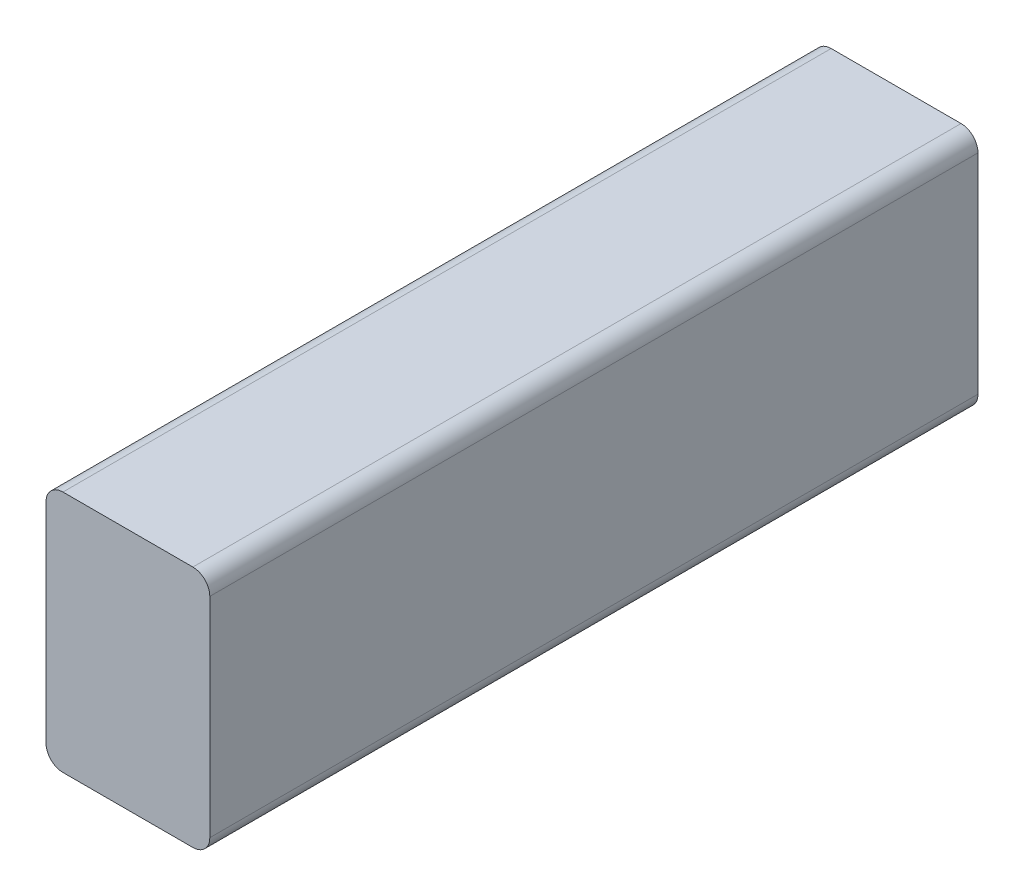
ISO-10303-21;
HEADER;
FILE_DESCRIPTION(('STEP AP214'),'2;1');
FILE_NAME('part.step','',(''),(''),'','','');
FILE_SCHEMA(('AUTOMOTIVE_DESIGN { 1 0 10303 214 1 1 1 1 }'));
ENDSEC;
DATA;
#1=APPLICATION_CONTEXT('core data for automotive mechanical design processes');
#2=APPLICATION_PROTOCOL_DEFINITION('international standard','automotive_design',2000,#1);
#3=PRODUCT_CONTEXT('',#1,'mechanical');
#4=PRODUCT('Part','Part','',(#3));
#5=PRODUCT_RELATED_PRODUCT_CATEGORY('part','',(#4));
#6=PRODUCT_DEFINITION_FORMATION('','',#4);
#7=PRODUCT_DEFINITION_CONTEXT('part definition',#1,'design');
#8=PRODUCT_DEFINITION('design','',#6,#7);
#9=PRODUCT_DEFINITION_SHAPE('','',#8);
#10=(LENGTH_UNIT() NAMED_UNIT(*) SI_UNIT(.MILLI.,.METRE.));
#11=(NAMED_UNIT(*) PLANE_ANGLE_UNIT() SI_UNIT($,.RADIAN.));
#12=(NAMED_UNIT(*) SI_UNIT($,.STERADIAN.) SOLID_ANGLE_UNIT());
#13=UNCERTAINTY_MEASURE_WITH_UNIT(LENGTH_MEASURE(1.E-05),#10,'distance_accuracy_value','');
#14=(GEOMETRIC_REPRESENTATION_CONTEXT(3) GLOBAL_UNCERTAINTY_ASSIGNED_CONTEXT((#13)) GLOBAL_UNIT_ASSIGNED_CONTEXT((#10,
#11,#12)) REPRESENTATION_CONTEXT('',''));
#15=CARTESIAN_POINT('',(0.,0.,0.));
#16=DIRECTION('',(0.,0.,1.));
#17=DIRECTION('',(1.,0.,0.));
#18=AXIS2_PLACEMENT_3D('',#15,#16,#17);
#19=CARTESIAN_POINT('',(14.5,21.5,136.));
#20=DIRECTION('',(-1.,0.,0.));
#21=DIRECTION('',(0.,-1.,0.));
#22=AXIS2_PLACEMENT_3D('',#19,#20,#21);
#23=PLANE('',#22);
#24=DIRECTION('',(0.,1.,0.));
#25=VECTOR('',#24,1.);
#26=CARTESIAN_POINT('',(14.5,21.5,136.));
#27=LINE('',#26,#25);
#28=CARTESIAN_POINT('',(14.5,-18.5,136.));
#29=VERTEX_POINT('',#28);
#30=CARTESIAN_POINT('',(14.5,18.5,136.));
#31=VERTEX_POINT('',#30);
#32=EDGE_CURVE('E130',#29,#31,#27,.T.);
#33=ORIENTED_EDGE('',*,*,#32,.F.);
#34=DIRECTION('',(0.,0.,-1.));
#35=VECTOR('',#34,1.);
#36=CARTESIAN_POINT('',(14.5,-18.5,136.));
#37=LINE('',#36,#35);
#38=CARTESIAN_POINT('',(14.5,-18.5,0.));
#39=VERTEX_POINT('',#38);
#40=EDGE_CURVE('E114',#29,#39,#37,.T.);
#41=ORIENTED_EDGE('',*,*,#40,.T.);
#42=DIRECTION('',(0.,1.,0.));
#43=VECTOR('',#42,1.);
#44=CARTESIAN_POINT('',(14.5,21.5,0.));
#45=LINE('',#44,#43);
#46=CARTESIAN_POINT('',(14.5,18.5,0.));
#47=VERTEX_POINT('',#46);
#48=EDGE_CURVE('E127',#39,#47,#45,.T.);
#49=ORIENTED_EDGE('',*,*,#48,.T.);
#50=DIRECTION('',(0.,0.,-1.));
#51=VECTOR('',#50,1.);
#52=CARTESIAN_POINT('',(14.5,18.5,136.));
#53=LINE('',#52,#51);
#54=EDGE_CURVE('E133',#47,#31,#53,.F.);
#55=ORIENTED_EDGE('',*,*,#54,.T.);
#56=EDGE_LOOP('',(#33,#41,#49,#55));
#57=FACE_BOUND('',#56,.T.);
#58=ADVANCED_FACE('F43',(#57),#23,.F.);
#59=CARTESIAN_POINT('',(-14.5,21.5,136.));
#60=DIRECTION('',(0.,-1.,0.));
#61=DIRECTION('',(0.,0.,-1.));
#62=AXIS2_PLACEMENT_3D('',#59,#60,#61);
#63=PLANE('',#62);
#64=DIRECTION('',(-1.,0.,0.));
#65=VECTOR('',#64,1.);
#66=CARTESIAN_POINT('',(-14.5,21.5,0.));
#67=LINE('',#66,#65);
#68=CARTESIAN_POINT('',(11.5,21.5,0.));
#69=VERTEX_POINT('',#68);
#70=CARTESIAN_POINT('',(-11.5,21.5,0.));
#71=VERTEX_POINT('',#70);
#72=EDGE_CURVE('E138',#69,#71,#67,.T.);
#73=ORIENTED_EDGE('',*,*,#72,.T.);
#74=DIRECTION('',(0.,0.,-1.));
#75=VECTOR('',#74,1.);
#76=CARTESIAN_POINT('',(-11.5,21.5,136.));
#77=LINE('',#76,#75);
#78=CARTESIAN_POINT('',(-11.5,21.5,136.));
#79=VERTEX_POINT('',#78);
#80=EDGE_CURVE('E11',#71,#79,#77,.F.);
#81=ORIENTED_EDGE('',*,*,#80,.T.);
#82=DIRECTION('',(-1.,0.,0.));
#83=VECTOR('',#82,1.);
#84=CARTESIAN_POINT('',(-14.5,21.5,136.));
#85=LINE('',#84,#83);
#86=CARTESIAN_POINT('',(11.5,21.5,136.));
#87=VERTEX_POINT('',#86);
#88=EDGE_CURVE('E190',#87,#79,#85,.T.);
#89=ORIENTED_EDGE('',*,*,#88,.F.);
#90=DIRECTION('',(0.,0.,-1.));
#91=VECTOR('',#90,1.);
#92=CARTESIAN_POINT('',(11.5,21.5,136.));
#93=LINE('',#92,#91);
#94=EDGE_CURVE('E52',#87,#69,#93,.T.);
#95=ORIENTED_EDGE('',*,*,#94,.T.);
#96=EDGE_LOOP('',(#73,#81,#89,#95));
#97=FACE_BOUND('',#96,.T.);
#98=ADVANCED_FACE('F188',(#97),#63,.F.);
#99=CARTESIAN_POINT('',(-14.5,21.5,136.));
#100=DIRECTION('',(1.,0.,0.));
#101=DIRECTION('',(0.,1.,0.));
#102=AXIS2_PLACEMENT_3D('',#99,#100,#101);
#103=PLANE('',#102);
#104=DIRECTION('',(0.,-1.,0.));
#105=VECTOR('',#104,1.);
#106=CARTESIAN_POINT('',(-14.5,21.5,0.));
#107=LINE('',#106,#105);
#108=CARTESIAN_POINT('',(-14.5,18.5,0.));
#109=VERTEX_POINT('',#108);
#110=CARTESIAN_POINT('',(-14.5,-18.5,0.));
#111=VERTEX_POINT('',#110);
#112=EDGE_CURVE('E142',#109,#111,#107,.T.);
#113=ORIENTED_EDGE('',*,*,#112,.T.);
#114=DIRECTION('',(0.,0.,-1.));
#115=VECTOR('',#114,1.);
#116=CARTESIAN_POINT('',(-14.5,-18.5,136.));
#117=LINE('',#116,#115);
#118=CARTESIAN_POINT('',(-14.5,-18.5,136.));
#119=VERTEX_POINT('',#118);
#120=EDGE_CURVE('E59',#111,#119,#117,.F.);
#121=ORIENTED_EDGE('',*,*,#120,.T.);
#122=DIRECTION('',(0.,-1.,0.));
#123=VECTOR('',#122,1.);
#124=CARTESIAN_POINT('',(-14.5,21.5,136.));
#125=LINE('',#124,#123);
#126=CARTESIAN_POINT('',(-14.5,18.5,136.));
#127=VERTEX_POINT('',#126);
#128=EDGE_CURVE('E198',#127,#119,#125,.T.);
#129=ORIENTED_EDGE('',*,*,#128,.F.);
#130=DIRECTION('',(0.,0.,-1.));
#131=VECTOR('',#130,1.);
#132=CARTESIAN_POINT('',(-14.5,18.5,136.));
#133=LINE('',#132,#131);
#134=EDGE_CURVE('E178',#127,#109,#133,.T.);
#135=ORIENTED_EDGE('',*,*,#134,.T.);
#136=EDGE_LOOP('',(#113,#121,#129,#135));
#137=FACE_BOUND('',#136,.T.);
#138=ADVANCED_FACE('F197',(#137),#103,.F.);
#139=CARTESIAN_POINT('',(-14.5,-21.5,136.));
#140=DIRECTION('',(0.,1.,0.));
#141=DIRECTION('',(0.,0.,1.));
#142=AXIS2_PLACEMENT_3D('',#139,#140,#141);
#143=PLANE('',#142);
#144=DIRECTION('',(1.,0.,0.));
#145=VECTOR('',#144,1.);
#146=CARTESIAN_POINT('',(-14.5,-21.5,0.));
#147=LINE('',#146,#145);
#148=CARTESIAN_POINT('',(-11.5,-21.5,0.));
#149=VERTEX_POINT('',#148);
#150=CARTESIAN_POINT('',(11.5,-21.5,0.));
#151=VERTEX_POINT('',#150);
#152=EDGE_CURVE('E150',#149,#151,#147,.T.);
#153=ORIENTED_EDGE('',*,*,#152,.T.);
#154=DIRECTION('',(0.,0.,-1.));
#155=VECTOR('',#154,1.);
#156=CARTESIAN_POINT('',(11.5,-21.5,136.));
#157=LINE('',#156,#155);
#158=CARTESIAN_POINT('',(11.5,-21.5,136.));
#159=VERTEX_POINT('',#158);
#160=EDGE_CURVE('E115',#151,#159,#157,.F.);
#161=ORIENTED_EDGE('',*,*,#160,.T.);
#162=DIRECTION('',(1.,0.,0.));
#163=VECTOR('',#162,1.);
#164=CARTESIAN_POINT('',(-14.5,-21.5,136.));
#165=LINE('',#164,#163);
#166=CARTESIAN_POINT('',(-11.5,-21.5,136.));
#167=VERTEX_POINT('',#166);
#168=EDGE_CURVE('E145',#167,#159,#165,.T.);
#169=ORIENTED_EDGE('',*,*,#168,.F.);
#170=DIRECTION('',(0.,0.,-1.));
#171=VECTOR('',#170,1.);
#172=CARTESIAN_POINT('',(-11.5,-21.5,136.));
#173=LINE('',#172,#171);
#174=EDGE_CURVE('E121',#167,#149,#173,.T.);
#175=ORIENTED_EDGE('',*,*,#174,.T.);
#176=EDGE_LOOP('',(#153,#161,#169,#175));
#177=FACE_BOUND('',#176,.T.);
#178=ADVANCED_FACE('F230',(#177),#143,.F.);
#179=CARTESIAN_POINT('',(0.,0.,136.));
#180=DIRECTION('',(0.,0.,1.));
#181=DIRECTION('',(1.,0.,0.));
#182=AXIS2_PLACEMENT_3D('',#179,#180,#181);
#183=PLANE('',#182);
#184=ORIENTED_EDGE('',*,*,#168,.T.);
#185=CARTESIAN_POINT('',(11.5,-18.5,136.));
#186=DIRECTION('',(0.,0.,1.));
#187=DIRECTION('',(1.,0.,0.));
#188=AXIS2_PLACEMENT_3D('',#185,#186,#187);
#189=CIRCLE('',#188,3.);
#190=EDGE_CURVE('E175',#159,#29,#189,.T.);
#191=ORIENTED_EDGE('',*,*,#190,.T.);
#192=ORIENTED_EDGE('',*,*,#32,.T.);
#193=CARTESIAN_POINT('',(11.5,18.5,136.));
#194=DIRECTION('',(0.,0.,1.));
#195=DIRECTION('',(1.,0.,0.));
#196=AXIS2_PLACEMENT_3D('',#193,#194,#195);
#197=CIRCLE('',#196,3.);
#198=EDGE_CURVE('E167',#31,#87,#197,.T.);
#199=ORIENTED_EDGE('',*,*,#198,.T.);
#200=ORIENTED_EDGE('',*,*,#88,.T.);
#201=CARTESIAN_POINT('',(-11.5,18.5,136.));
#202=DIRECTION('',(0.,0.,1.));
#203=DIRECTION('',(1.,0.,0.));
#204=AXIS2_PLACEMENT_3D('',#201,#202,#203);
#205=CIRCLE('',#204,3.);
#206=EDGE_CURVE('E66',#79,#127,#205,.T.);
#207=ORIENTED_EDGE('',*,*,#206,.T.);
#208=ORIENTED_EDGE('',*,*,#128,.T.);
#209=CARTESIAN_POINT('',(-11.5,-18.5,136.));
#210=DIRECTION('',(0.,0.,1.));
#211=DIRECTION('',(1.,0.,0.));
#212=AXIS2_PLACEMENT_3D('',#209,#210,#211);
#213=CIRCLE('',#212,3.);
#214=EDGE_CURVE('E172',#119,#167,#213,.T.);
#215=ORIENTED_EDGE('',*,*,#214,.T.);
#216=EDGE_LOOP('',(#184,#191,#192,#199,#200,#207,#208,#215));
#217=FACE_BOUND('',#216,.T.);
#218=ADVANCED_FACE('F207',(#217),#183,.T.);
#219=CARTESIAN_POINT('',(0.,0.,0.));
#220=DIRECTION('',(0.,0.,1.));
#221=DIRECTION('',(1.,0.,0.));
#222=AXIS2_PLACEMENT_3D('',#219,#220,#221);
#223=PLANE('',#222);
#224=ORIENTED_EDGE('',*,*,#48,.F.);
#225=CARTESIAN_POINT('',(11.5,-18.5,0.));
#226=DIRECTION('',(0.,0.,1.));
#227=DIRECTION('',(1.,0.,0.));
#228=AXIS2_PLACEMENT_3D('',#225,#226,#227);
#229=CIRCLE('',#228,3.);
#230=EDGE_CURVE('E110',#39,#151,#229,.F.);
#231=ORIENTED_EDGE('',*,*,#230,.T.);
#232=ORIENTED_EDGE('',*,*,#152,.F.);
#233=CARTESIAN_POINT('',(-11.5,-18.5,0.));
#234=DIRECTION('',(0.,0.,1.));
#235=DIRECTION('',(1.,0.,0.));
#236=AXIS2_PLACEMENT_3D('',#233,#234,#235);
#237=CIRCLE('',#236,3.);
#238=EDGE_CURVE('E122',#149,#111,#237,.F.);
#239=ORIENTED_EDGE('',*,*,#238,.T.);
#240=ORIENTED_EDGE('',*,*,#112,.F.);
#241=CARTESIAN_POINT('',(-11.5,18.5,0.));
#242=DIRECTION('',(0.,0.,1.));
#243=DIRECTION('',(1.,0.,0.));
#244=AXIS2_PLACEMENT_3D('',#241,#242,#243);
#245=CIRCLE('',#244,3.);
#246=EDGE_CURVE('E157',#109,#71,#245,.F.);
#247=ORIENTED_EDGE('',*,*,#246,.T.);
#248=ORIENTED_EDGE('',*,*,#72,.F.);
#249=CARTESIAN_POINT('',(11.5,18.5,0.));
#250=DIRECTION('',(0.,0.,1.));
#251=DIRECTION('',(1.,0.,0.));
#252=AXIS2_PLACEMENT_3D('',#249,#250,#251);
#253=CIRCLE('',#252,3.);
#254=EDGE_CURVE('E132',#69,#47,#253,.F.);
#255=ORIENTED_EDGE('',*,*,#254,.T.);
#256=EDGE_LOOP('',(#224,#231,#232,#239,#240,#247,#248,#255));
#257=FACE_BOUND('',#256,.T.);
#258=ADVANCED_FACE('F135',(#257),#223,.F.);
#259=CARTESIAN_POINT('',(11.5,-18.5,136.));
#260=DIRECTION('',(0.,0.,-1.));
#261=DIRECTION('',(-1.,0.,0.));
#262=AXIS2_PLACEMENT_3D('',#259,#260,#261);
#263=CYLINDRICAL_SURFACE('',#262,3.);
#264=ORIENTED_EDGE('',*,*,#190,.F.);
#265=ORIENTED_EDGE('',*,*,#160,.F.);
#266=ORIENTED_EDGE('',*,*,#230,.F.);
#267=ORIENTED_EDGE('',*,*,#40,.F.);
#268=EDGE_LOOP('',(#264,#265,#266,#267));
#269=FACE_BOUND('',#268,.T.);
#270=ADVANCED_FACE('F113',(#269),#263,.T.);
#271=CARTESIAN_POINT('',(-11.5,-18.5,136.));
#272=DIRECTION('',(0.,0.,-1.));
#273=DIRECTION('',(-1.,0.,0.));
#274=AXIS2_PLACEMENT_3D('',#271,#272,#273);
#275=CYLINDRICAL_SURFACE('',#274,3.);
#276=ORIENTED_EDGE('',*,*,#214,.F.);
#277=ORIENTED_EDGE('',*,*,#120,.F.);
#278=ORIENTED_EDGE('',*,*,#238,.F.);
#279=ORIENTED_EDGE('',*,*,#174,.F.);
#280=EDGE_LOOP('',(#276,#277,#278,#279));
#281=FACE_BOUND('',#280,.T.);
#282=ADVANCED_FACE('F212',(#281),#275,.T.);
#283=CARTESIAN_POINT('',(-11.5,18.5,136.));
#284=DIRECTION('',(0.,0.,-1.));
#285=DIRECTION('',(-1.,0.,0.));
#286=AXIS2_PLACEMENT_3D('',#283,#284,#285);
#287=CYLINDRICAL_SURFACE('',#286,3.);
#288=ORIENTED_EDGE('',*,*,#206,.F.);
#289=ORIENTED_EDGE('',*,*,#80,.F.);
#290=ORIENTED_EDGE('',*,*,#246,.F.);
#291=ORIENTED_EDGE('',*,*,#134,.F.);
#292=EDGE_LOOP('',(#288,#289,#290,#291));
#293=FACE_BOUND('',#292,.T.);
#294=ADVANCED_FACE('F196',(#293),#287,.T.);
#295=CARTESIAN_POINT('',(11.5,18.5,136.));
#296=DIRECTION('',(0.,0.,-1.));
#297=DIRECTION('',(-1.,0.,0.));
#298=AXIS2_PLACEMENT_3D('',#295,#296,#297);
#299=CYLINDRICAL_SURFACE('',#298,3.);
#300=ORIENTED_EDGE('',*,*,#198,.F.);
#301=ORIENTED_EDGE('',*,*,#54,.F.);
#302=ORIENTED_EDGE('',*,*,#254,.F.);
#303=ORIENTED_EDGE('',*,*,#94,.F.);
#304=EDGE_LOOP('',(#300,#301,#302,#303));
#305=FACE_BOUND('',#304,.T.);
#306=ADVANCED_FACE('F45',(#305),#299,.T.);
#307=CLOSED_SHELL('',(#58,#98,#138,#178,#218,#258,#270,#282,#294,#306));
#308=MANIFOLD_SOLID_BREP('B2',#307);
#309=ADVANCED_BREP_SHAPE_REPRESENTATION('',(#18,#308),#14);
#310=SHAPE_DEFINITION_REPRESENTATION(#9,#309);
ENDSEC;
END-ISO-10303-21;
